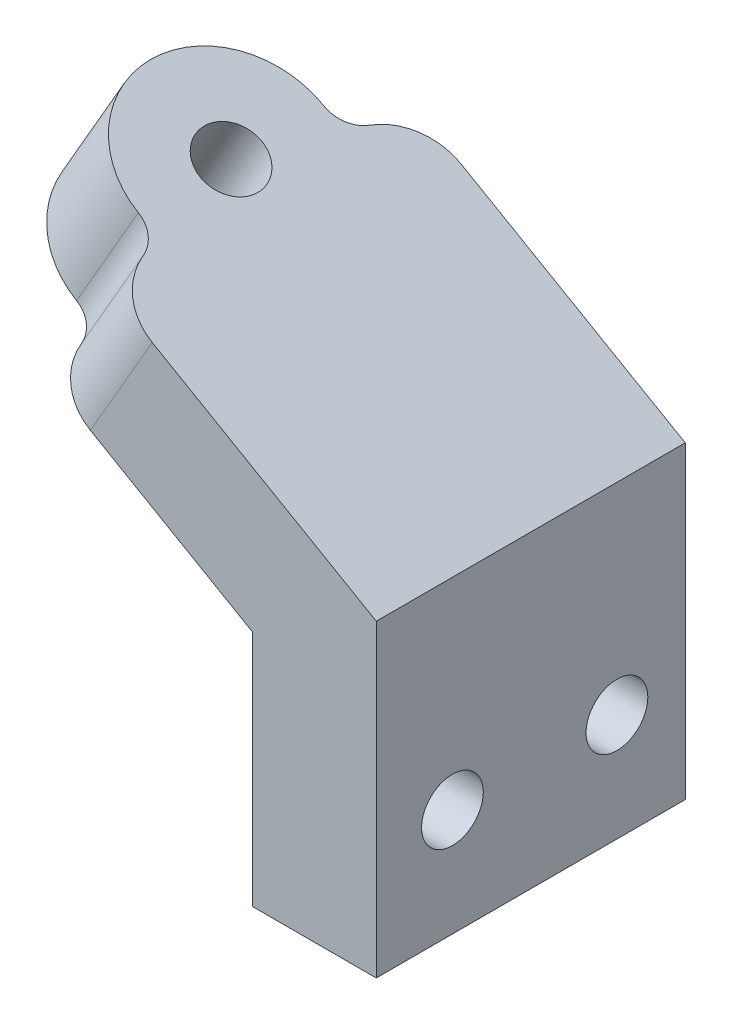
ISO-10303-21;
HEADER;
FILE_DESCRIPTION(('STEP AP214'),'2;1');
FILE_NAME('part.step','',(''),(''),'','','');
FILE_SCHEMA(('AUTOMOTIVE_DESIGN { 1 0 10303 214 1 1 1 1 }'));
ENDSEC;
DATA;
#1=APPLICATION_CONTEXT('core data for automotive mechanical design processes');
#2=APPLICATION_PROTOCOL_DEFINITION('international standard','automotive_design',2000,#1);
#3=PRODUCT_CONTEXT('',#1,'mechanical');
#4=PRODUCT('Part','Part','',(#3));
#5=PRODUCT_RELATED_PRODUCT_CATEGORY('part','',(#4));
#6=PRODUCT_DEFINITION_FORMATION('','',#4);
#7=PRODUCT_DEFINITION_CONTEXT('part definition',#1,'design');
#8=PRODUCT_DEFINITION('design','',#6,#7);
#9=PRODUCT_DEFINITION_SHAPE('','',#8);
#10=(LENGTH_UNIT() NAMED_UNIT(*) SI_UNIT(.MILLI.,.METRE.));
#11=(NAMED_UNIT(*) PLANE_ANGLE_UNIT() SI_UNIT($,.RADIAN.));
#12=(NAMED_UNIT(*) SI_UNIT($,.STERADIAN.) SOLID_ANGLE_UNIT());
#13=UNCERTAINTY_MEASURE_WITH_UNIT(LENGTH_MEASURE(1.E-05),#10,'distance_accuracy_value','');
#14=(GEOMETRIC_REPRESENTATION_CONTEXT(3) GLOBAL_UNCERTAINTY_ASSIGNED_CONTEXT((#13)) GLOBAL_UNIT_ASSIGNED_CONTEXT((#10,
#11,#12)) REPRESENTATION_CONTEXT('',''));
#15=CARTESIAN_POINT('',(0.,0.,0.));
#16=DIRECTION('',(0.,0.,1.));
#17=DIRECTION('',(1.,0.,0.));
#18=AXIS2_PLACEMENT_3D('',#15,#16,#17);
#19=CARTESIAN_POINT('',(10.,0.,50.));
#20=DIRECTION('',(-1.,0.,0.));
#21=DIRECTION('',(0.,-1.,0.));
#22=AXIS2_PLACEMENT_3D('',#19,#20,#21);
#23=PLANE('',#22);
#24=CARTESIAN_POINT('',(10.,17.3995743342104,37.6752128328949));
#25=DIRECTION('',(1.,0.,0.));
#26=DIRECTION('',(0.,0.,-1.));
#27=AXIS2_PLACEMENT_3D('',#24,#25,#26);
#28=CIRCLE('',#27,5.00000000000001);
#29=CARTESIAN_POINT('',(10.,17.3995743342104,32.6752128328949));
#30=VERTEX_POINT('',#29);
#31=EDGE_CURVE('E253',#30,#30,#28,.T.);
#32=ORIENTED_EDGE('',*,*,#31,.F.);
#33=EDGE_LOOP('',(#32));
#34=FACE_BOUND('',#33,.T.);
#35=DIRECTION('',(0.,1.,0.));
#36=VECTOR('',#35,1.);
#37=CARTESIAN_POINT('',(10.,0.,0.));
#38=LINE('',#37,#36);
#39=CARTESIAN_POINT('',(10.,0.,0.));
#40=VERTEX_POINT('',#39);
#41=CARTESIAN_POINT('',(9.99999999999999,50.,0.));
#42=VERTEX_POINT('',#41);
#43=EDGE_CURVE('E188',#40,#42,#38,.T.);
#44=ORIENTED_EDGE('',*,*,#43,.T.);
#45=DIRECTION('',(0.,0.,-1.));
#46=VECTOR('',#45,1.);
#47=CARTESIAN_POINT('',(9.99999999999999,50.,50.));
#48=LINE('',#47,#46);
#49=CARTESIAN_POINT('',(9.99999999999999,50.,50.));
#50=VERTEX_POINT('',#49);
#51=EDGE_CURVE('E199',#50,#42,#48,.T.);
#52=ORIENTED_EDGE('',*,*,#51,.F.);
#53=DIRECTION('',(0.,1.,0.));
#54=VECTOR('',#53,1.);
#55=CARTESIAN_POINT('',(10.,0.,50.));
#56=LINE('',#55,#54);
#57=CARTESIAN_POINT('',(10.,0.,50.));
#58=VERTEX_POINT('',#57);
#59=EDGE_CURVE('E172',#58,#50,#56,.T.);
#60=ORIENTED_EDGE('',*,*,#59,.F.);
#61=DIRECTION('',(0.,0.,-1.));
#62=VECTOR('',#61,1.);
#63=CARTESIAN_POINT('',(10.,0.,50.));
#64=LINE('',#63,#62);
#65=EDGE_CURVE('E203',#58,#40,#64,.T.);
#66=ORIENTED_EDGE('',*,*,#65,.T.);
#67=EDGE_LOOP('',(#44,#52,#60,#66));
#68=FACE_BOUND('',#67,.T.);
#69=CARTESIAN_POINT('',(10.,17.3995743342104,11.0572658838156));
#70=DIRECTION('',(1.,0.,0.));
#71=DIRECTION('',(0.,0.,-1.));
#72=AXIS2_PLACEMENT_3D('',#69,#70,#71);
#73=CIRCLE('',#72,5.00000000000001);
#74=CARTESIAN_POINT('',(10.,17.3995743342104,6.0572658838156));
#75=VERTEX_POINT('',#74);
#76=EDGE_CURVE('E247',#75,#75,#73,.T.);
#77=ORIENTED_EDGE('',*,*,#76,.F.);
#78=EDGE_LOOP('',(#77));
#79=FACE_BOUND('',#78,.T.);
#80=ADVANCED_FACE('F45',(#34,#68,#79),#23,.F.);
#81=CARTESIAN_POINT('',(-10.,38.4529946162074,50.));
#82=DIRECTION('',(1.,0.,0.));
#83=DIRECTION('',(0.,1.,0.));
#84=AXIS2_PLACEMENT_3D('',#81,#82,#83);
#85=PLANE('',#84);
#86=CARTESIAN_POINT('',(-10.,17.3995743342104,37.6752128328949));
#87=DIRECTION('',(1.,0.,0.));
#88=DIRECTION('',(0.,1.,0.));
#89=AXIS2_PLACEMENT_3D('',#86,#87,#88);
#90=CIRCLE('',#89,5.00000000000001);
#91=CARTESIAN_POINT('',(-10.,22.3995743342104,37.6752128328949));
#92=VERTEX_POINT('',#91);
#93=EDGE_CURVE('E49',#92,#92,#90,.T.);
#94=ORIENTED_EDGE('',*,*,#93,.T.);
#95=EDGE_LOOP('',(#94));
#96=FACE_BOUND('',#95,.T.);
#97=CARTESIAN_POINT('',(-10.,17.3995743342104,11.0572658838156));
#98=DIRECTION('',(1.,0.,0.));
#99=DIRECTION('',(0.,1.,0.));
#100=AXIS2_PLACEMENT_3D('',#97,#98,#99);
#101=CIRCLE('',#100,5.00000000000001);
#102=CARTESIAN_POINT('',(-10.,22.3995743342104,11.0572658838156));
#103=VERTEX_POINT('',#102);
#104=EDGE_CURVE('E241',#103,#103,#101,.T.);
#105=ORIENTED_EDGE('',*,*,#104,.T.);
#106=EDGE_LOOP('',(#105));
#107=FACE_BOUND('',#106,.T.);
#108=DIRECTION('',(0.,-1.,0.));
#109=VECTOR('',#108,1.);
#110=CARTESIAN_POINT('',(-10.,38.4529946162074,0.));
#111=LINE('',#110,#109);
#112=CARTESIAN_POINT('',(-10.,38.4529946162074,0.));
#113=VERTEX_POINT('',#112);
#114=CARTESIAN_POINT('',(-10.,0.,0.));
#115=VERTEX_POINT('',#114);
#116=EDGE_CURVE('E163',#113,#115,#111,.T.);
#117=ORIENTED_EDGE('',*,*,#116,.T.);
#118=DIRECTION('',(0.,0.,-1.));
#119=VECTOR('',#118,1.);
#120=CARTESIAN_POINT('',(-10.,0.,50.));
#121=LINE('',#120,#119);
#122=CARTESIAN_POINT('',(-10.,0.,50.));
#123=VERTEX_POINT('',#122);
#124=EDGE_CURVE('E207',#123,#115,#121,.T.);
#125=ORIENTED_EDGE('',*,*,#124,.F.);
#126=DIRECTION('',(0.,-1.,0.));
#127=VECTOR('',#126,1.);
#128=CARTESIAN_POINT('',(-10.,38.4529946162074,50.));
#129=LINE('',#128,#127);
#130=CARTESIAN_POINT('',(-10.,38.4529946162074,50.));
#131=VERTEX_POINT('',#130);
#132=EDGE_CURVE('E164',#131,#123,#129,.T.);
#133=ORIENTED_EDGE('',*,*,#132,.F.);
#134=DIRECTION('',(0.,0.,-1.));
#135=VECTOR('',#134,1.);
#136=CARTESIAN_POINT('',(-10.,38.4529946162074,50.));
#137=LINE('',#136,#135);
#138=EDGE_CURVE('E181',#131,#113,#137,.T.);
#139=ORIENTED_EDGE('',*,*,#138,.T.);
#140=EDGE_LOOP('',(#117,#125,#133,#139));
#141=FACE_BOUND('',#140,.T.);
#142=ADVANCED_FACE('F262',(#96,#107,#141),#85,.F.);
#143=CARTESIAN_POINT('',(-10.,0.,50.));
#144=DIRECTION('',(0.,1.,0.));
#145=DIRECTION('',(-1.,0.,0.));
#146=AXIS2_PLACEMENT_3D('',#143,#144,#145);
#147=PLANE('',#146);
#148=DIRECTION('',(1.,0.,0.));
#149=VECTOR('',#148,1.);
#150=CARTESIAN_POINT('',(-10.,0.,0.));
#151=LINE('',#150,#149);
#152=EDGE_CURVE('E185',#115,#40,#151,.T.);
#153=ORIENTED_EDGE('',*,*,#152,.T.);
#154=ORIENTED_EDGE('',*,*,#65,.F.);
#155=DIRECTION('',(1.,0.,0.));
#156=VECTOR('',#155,1.);
#157=CARTESIAN_POINT('',(-10.,0.,50.));
#158=LINE('',#157,#156);
#159=EDGE_CURVE('E168',#123,#58,#158,.T.);
#160=ORIENTED_EDGE('',*,*,#159,.F.);
#161=ORIENTED_EDGE('',*,*,#124,.T.);
#162=EDGE_LOOP('',(#153,#154,#160,#161));
#163=FACE_BOUND('',#162,.T.);
#164=ADVANCED_FACE('F282',(#163),#147,.F.);
#165=CARTESIAN_POINT('',(9.99999999999999,50.,50.));
#166=DIRECTION('',(-0.499999999999997,-0.86602540378444,0.));
#167=DIRECTION('',(0.86602540378444,-0.499999999999998,0.));
#168=AXIS2_PLACEMENT_3D('',#165,#166,#167);
#169=PLANE('',#168);
#170=CARTESIAN_POINT('',(-38.4974226119287,78.,25.));
#171=DIRECTION('',(0.499999999999998,0.86602540378444,0.));
#172=DIRECTION('',(-0.86602540378444,0.499999999999998,0.));
#173=AXIS2_PLACEMENT_3D('',#170,#171,#172);
#174=CIRCLE('',#173,5.00000000000002);
#175=CARTESIAN_POINT('',(-42.8275496308509,80.5,25.));
#176=VERTEX_POINT('',#175);
#177=EDGE_CURVE('E235',#176,#176,#174,.T.);
#178=ORIENTED_EDGE('',*,*,#177,.F.);
#179=EDGE_LOOP('',(#178));
#180=FACE_BOUND('',#179,.T.);
#181=DIRECTION('',(-0.86602540378444,0.499999999999997,0.));
#182=VECTOR('',#181,1.);
#183=CARTESIAN_POINT('',(9.99999999999999,50.,0.));
#184=LINE('',#183,#182);
#185=CARTESIAN_POINT('',(-26.2499738980128,70.9289321881345,0.));
#186=VERTEX_POINT('',#185);
#187=EDGE_CURVE('E191',#42,#186,#184,.T.);
#188=ORIENTED_EDGE('',*,*,#187,.T.);
#189=CARTESIAN_POINT('',(-26.2499738980128,70.9289321881345,10.));
#190=DIRECTION('',(-0.499999999999997,-0.86602540378444,0.));
#191=DIRECTION('',(0.86602540378444,-0.499999999999998,0.));
#192=AXIS2_PLACEMENT_3D('',#189,#190,#191);
#193=CIRCLE('',#192,10.);
#194=CARTESIAN_POINT('',(-34.4149397072901,75.6429773960448,6.66666666666667));
#195=VERTEX_POINT('',#194);
#196=EDGE_CURVE('E220',#186,#195,#193,.F.);
#197=ORIENTED_EDGE('',*,*,#196,.T.);
#198=CARTESIAN_POINT('',(-38.4974226119287,78.,5.00000000000001));
#199=DIRECTION('',(0.499999999999998,0.86602540378444,0.));
#200=DIRECTION('',(-0.86602540378444,0.499999999999998,0.));
#201=AXIS2_PLACEMENT_3D('',#198,#199,#200);
#202=CIRCLE('',#201,5.);
#203=CARTESIAN_POINT('',(-38.4974226119287,78.,10.));
#204=VERTEX_POINT('',#203);
#205=EDGE_CURVE('E134',#204,#195,#202,.T.);
#206=ORIENTED_EDGE('',*,*,#205,.F.);
#207=CARTESIAN_POINT('',(-38.4974226119287,78.,25.));
#208=DIRECTION('',(-0.499999999999998,-0.86602540378444,0.));
#209=DIRECTION('',(-0.86602540378444,0.499999999999998,0.));
#210=AXIS2_PLACEMENT_3D('',#207,#208,#209);
#211=CIRCLE('',#210,15.);
#212=CARTESIAN_POINT('',(-38.4974226119287,78.,40.));
#213=VERTEX_POINT('',#212);
#214=EDGE_CURVE('E133',#213,#204,#211,.T.);
#215=ORIENTED_EDGE('',*,*,#214,.F.);
#216=CARTESIAN_POINT('',(-38.4974226119287,78.,45.));
#217=DIRECTION('',(0.499999999999998,0.86602540378444,0.));
#218=DIRECTION('',(0.86602540378444,-0.499999999999998,0.));
#219=AXIS2_PLACEMENT_3D('',#216,#217,#218);
#220=CIRCLE('',#219,4.99999999999999);
#221=CARTESIAN_POINT('',(-34.4149397072901,75.6429773960448,43.3333333333333));
#222=VERTEX_POINT('',#221);
#223=EDGE_CURVE('E125',#222,#213,#220,.T.);
#224=ORIENTED_EDGE('',*,*,#223,.F.);
#225=CARTESIAN_POINT('',(-26.2499738980128,70.9289321881345,40.));
#226=DIRECTION('',(-0.499999999999997,-0.86602540378444,0.));
#227=DIRECTION('',(0.86602540378444,-0.499999999999998,0.));
#228=AXIS2_PLACEMENT_3D('',#225,#226,#227);
#229=CIRCLE('',#228,10.);
#230=CARTESIAN_POINT('',(-26.2499738980128,70.9289321881345,50.));
#231=VERTEX_POINT('',#230);
#232=EDGE_CURVE('E217',#222,#231,#229,.F.);
#233=ORIENTED_EDGE('',*,*,#232,.T.);
#234=DIRECTION('',(-0.86602540378444,0.499999999999997,0.));
#235=VECTOR('',#234,1.);
#236=CARTESIAN_POINT('',(9.99999999999999,50.,50.));
#237=LINE('',#236,#235);
#238=EDGE_CURVE('E175',#50,#231,#237,.T.);
#239=ORIENTED_EDGE('',*,*,#238,.F.);
#240=ORIENTED_EDGE('',*,*,#51,.T.);
#241=EDGE_LOOP('',(#188,#197,#206,#215,#224,#233,#239,#240));
#242=FACE_BOUND('',#241,.T.);
#243=ADVANCED_FACE('F148',(#180,#242),#169,.F.);
#244=CARTESIAN_POINT('',(-62.3538290724797,68.679491924311,50.));
#245=DIRECTION('',(0.499999999999998,0.86602540378444,0.));
#246=DIRECTION('',(-0.86602540378444,0.499999999999998,0.));
#247=AXIS2_PLACEMENT_3D('',#244,#245,#246);
#248=PLANE('',#247);
#249=CARTESIAN_POINT('',(-48.4974226119287,60.6794919243111,25.));
#250=DIRECTION('',(0.499999999999998,0.86602540378444,0.));
#251=DIRECTION('',(-0.86602540378444,0.499999999999998,0.));
#252=AXIS2_PLACEMENT_3D('',#249,#250,#251);
#253=CIRCLE('',#252,5.00000000000001);
#254=CARTESIAN_POINT('',(-52.8275496308509,63.1794919243111,25.));
#255=VERTEX_POINT('',#254);
#256=EDGE_CURVE('E232',#255,#255,#253,.T.);
#257=ORIENTED_EDGE('',*,*,#256,.T.);
#258=EDGE_LOOP('',(#257));
#259=FACE_BOUND('',#258,.T.);
#260=CARTESIAN_POINT('',(-48.4974226119287,60.6794919243111,5.00000000000001));
#261=DIRECTION('',(0.499999999999998,0.86602540378444,0.));
#262=DIRECTION('',(-0.86602540378444,0.499999999999998,0.));
#263=AXIS2_PLACEMENT_3D('',#260,#261,#262);
#264=CIRCLE('',#263,5.);
#265=CARTESIAN_POINT('',(-48.4974226119287,60.6794919243111,10.));
#266=VERTEX_POINT('',#265);
#267=CARTESIAN_POINT('',(-44.4149397072901,58.322469320356,6.66666666666667));
#268=VERTEX_POINT('',#267);
#269=EDGE_CURVE('E155',#266,#268,#264,.T.);
#270=ORIENTED_EDGE('',*,*,#269,.T.);
#271=CARTESIAN_POINT('',(-36.2499738980128,53.6084241124457,10.));
#272=DIRECTION('',(0.499999999999998,0.86602540378444,0.));
#273=DIRECTION('',(-0.86602540378444,0.499999999999998,0.));
#274=AXIS2_PLACEMENT_3D('',#271,#272,#273);
#275=CIRCLE('',#274,10.);
#276=CARTESIAN_POINT('',(-36.2499738980128,53.6084241124457,0.));
#277=VERTEX_POINT('',#276);
#278=EDGE_CURVE('E228',#268,#277,#275,.F.);
#279=ORIENTED_EDGE('',*,*,#278,.T.);
#280=DIRECTION('',(0.86602540378444,-0.499999999999998,0.));
#281=VECTOR('',#280,1.);
#282=CARTESIAN_POINT('',(-62.3538290724797,68.679491924311,0.));
#283=LINE('',#282,#281);
#284=EDGE_CURVE('E169',#277,#113,#283,.T.);
#285=ORIENTED_EDGE('',*,*,#284,.T.);
#286=ORIENTED_EDGE('',*,*,#138,.F.);
#287=DIRECTION('',(0.86602540378444,-0.499999999999998,0.));
#288=VECTOR('',#287,1.);
#289=CARTESIAN_POINT('',(-62.3538290724797,68.679491924311,50.));
#290=LINE('',#289,#288);
#291=CARTESIAN_POINT('',(-36.2499738980128,53.6084241124457,50.));
#292=VERTEX_POINT('',#291);
#293=EDGE_CURVE('E178',#292,#131,#290,.T.);
#294=ORIENTED_EDGE('',*,*,#293,.F.);
#295=CARTESIAN_POINT('',(-36.2499738980128,53.6084241124457,40.));
#296=DIRECTION('',(0.499999999999998,0.86602540378444,0.));
#297=DIRECTION('',(-0.86602540378444,0.499999999999998,0.));
#298=AXIS2_PLACEMENT_3D('',#295,#296,#297);
#299=CIRCLE('',#298,10.);
#300=CARTESIAN_POINT('',(-44.4149397072901,58.322469320356,43.3333333333333));
#301=VERTEX_POINT('',#300);
#302=EDGE_CURVE('E63',#292,#301,#299,.F.);
#303=ORIENTED_EDGE('',*,*,#302,.T.);
#304=CARTESIAN_POINT('',(-48.4974226119287,60.6794919243111,45.));
#305=DIRECTION('',(0.499999999999998,0.86602540378444,0.));
#306=DIRECTION('',(-0.86602540378444,0.499999999999998,0.));
#307=AXIS2_PLACEMENT_3D('',#304,#305,#306);
#308=CIRCLE('',#307,4.99999999999999);
#309=CARTESIAN_POINT('',(-48.4974226119287,60.6794919243111,40.));
#310=VERTEX_POINT('',#309);
#311=EDGE_CURVE('E160',#301,#310,#308,.T.);
#312=ORIENTED_EDGE('',*,*,#311,.T.);
#313=CARTESIAN_POINT('',(-48.4974226119287,60.6794919243111,25.));
#314=DIRECTION('',(0.499999999999998,0.86602540378444,0.));
#315=DIRECTION('',(-0.86602540378444,0.499999999999998,0.));
#316=AXIS2_PLACEMENT_3D('',#313,#314,#315);
#317=CIRCLE('',#316,15.);
#318=EDGE_CURVE('E143',#310,#266,#317,.F.);
#319=ORIENTED_EDGE('',*,*,#318,.T.);
#320=EDGE_LOOP('',(#270,#279,#285,#286,#294,#303,#312,#319));
#321=FACE_BOUND('',#320,.T.);
#322=ADVANCED_FACE('F305',(#259,#321),#248,.F.);
#323=CARTESIAN_POINT('',(0.,0.,50.));
#324=DIRECTION('',(0.,0.,1.));
#325=DIRECTION('',(1.,0.,0.));
#326=AXIS2_PLACEMENT_3D('',#323,#324,#325);
#327=PLANE('',#326);
#328=ORIENTED_EDGE('',*,*,#238,.T.);
#329=DIRECTION('',(-0.499999999999998,-0.86602540378444,0.));
#330=VECTOR('',#329,1.);
#331=CARTESIAN_POINT('',(-36.2499738980128,53.6084241124457,50.));
#332=LINE('',#331,#330);
#333=EDGE_CURVE('E11',#231,#292,#332,.T.);
#334=ORIENTED_EDGE('',*,*,#333,.T.);
#335=ORIENTED_EDGE('',*,*,#293,.T.);
#336=ORIENTED_EDGE('',*,*,#132,.T.);
#337=ORIENTED_EDGE('',*,*,#159,.T.);
#338=ORIENTED_EDGE('',*,*,#59,.T.);
#339=EDGE_LOOP('',(#328,#334,#335,#336,#337,#338));
#340=FACE_BOUND('',#339,.T.);
#341=ADVANCED_FACE('F316',(#340),#327,.T.);
#342=CARTESIAN_POINT('',(0.,0.,0.));
#343=DIRECTION('',(0.,0.,1.));
#344=DIRECTION('',(1.,0.,0.));
#345=AXIS2_PLACEMENT_3D('',#342,#343,#344);
#346=PLANE('',#345);
#347=ORIENTED_EDGE('',*,*,#284,.F.);
#348=DIRECTION('',(0.499999999999998,0.86602540378444,0.));
#349=VECTOR('',#348,1.);
#350=CARTESIAN_POINT('',(-50.4006089926237,29.0988051692122,0.));
#351=LINE('',#350,#349);
#352=EDGE_CURVE('E213',#277,#186,#351,.T.);
#353=ORIENTED_EDGE('',*,*,#352,.T.);
#354=ORIENTED_EDGE('',*,*,#187,.F.);
#355=ORIENTED_EDGE('',*,*,#43,.F.);
#356=ORIENTED_EDGE('',*,*,#152,.F.);
#357=ORIENTED_EDGE('',*,*,#116,.F.);
#358=EDGE_LOOP('',(#347,#353,#354,#355,#356,#357));
#359=FACE_BOUND('',#358,.T.);
#360=ADVANCED_FACE('F309',(#359),#346,.F.);
#361=CARTESIAN_POINT('',(-78.2365149746594,9.16987298107767,25.));
#362=DIRECTION('',(0.499999999999998,0.86602540378444,0.));
#363=DIRECTION('',(-0.86602540378444,0.499999999999998,0.));
#364=AXIS2_PLACEMENT_3D('',#361,#362,#363);
#365=CYLINDRICAL_SURFACE('',#364,15.);
#366=DIRECTION('',(0.499999999999998,0.86602540378444,0.));
#367=VECTOR('',#366,1.);
#368=CARTESIAN_POINT('',(-78.2365149746594,9.16987298107767,40.));
#369=LINE('',#368,#367);
#370=EDGE_CURVE('E128',#310,#213,#369,.T.);
#371=ORIENTED_EDGE('',*,*,#370,.T.);
#372=ORIENTED_EDGE('',*,*,#214,.T.);
#373=DIRECTION('',(0.499999999999998,0.86602540378444,0.));
#374=VECTOR('',#373,1.);
#375=CARTESIAN_POINT('',(-78.2365149746594,9.16987298107767,10.));
#376=LINE('',#375,#374);
#377=EDGE_CURVE('E145',#266,#204,#376,.T.);
#378=ORIENTED_EDGE('',*,*,#377,.F.);
#379=ORIENTED_EDGE('',*,*,#318,.F.);
#380=EDGE_LOOP('',(#371,#372,#378,#379));
#381=FACE_BOUND('',#380,.T.);
#382=ADVANCED_FACE('F139',(#381),#365,.T.);
#383=CARTESIAN_POINT('',(-78.2365149746594,9.16987298107767,45.));
#384=DIRECTION('',(0.499999999999998,0.86602540378444,0.));
#385=DIRECTION('',(-0.86602540378444,0.499999999999998,0.));
#386=AXIS2_PLACEMENT_3D('',#383,#384,#385);
#387=CYLINDRICAL_SURFACE('',#386,4.99999999999999);
#388=ORIENTED_EDGE('',*,*,#311,.F.);
#389=DIRECTION('',(0.499999999999998,0.86602540378444,0.));
#390=VECTOR('',#389,1.);
#391=CARTESIAN_POINT('',(-74.1540320700208,6.81285037712253,43.3333333333333));
#392=LINE('',#391,#390);
#393=EDGE_CURVE('E55',#301,#222,#392,.T.);
#394=ORIENTED_EDGE('',*,*,#393,.T.);
#395=ORIENTED_EDGE('',*,*,#223,.T.);
#396=ORIENTED_EDGE('',*,*,#370,.F.);
#397=EDGE_LOOP('',(#388,#394,#395,#396));
#398=FACE_BOUND('',#397,.T.);
#399=ADVANCED_FACE('F127',(#398),#387,.F.);
#400=CARTESIAN_POINT('',(-78.2365149746594,9.16987298107767,5.00000000000001));
#401=DIRECTION('',(0.499999999999998,0.86602540378444,0.));
#402=DIRECTION('',(-0.86602540378444,0.499999999999998,0.));
#403=AXIS2_PLACEMENT_3D('',#400,#401,#402);
#404=CYLINDRICAL_SURFACE('',#403,5.);
#405=ORIENTED_EDGE('',*,*,#205,.T.);
#406=DIRECTION('',(0.499999999999998,0.86602540378444,0.));
#407=VECTOR('',#406,1.);
#408=CARTESIAN_POINT('',(-74.1540320700207,6.81285037712252,6.66666666666667));
#409=LINE('',#408,#407);
#410=EDGE_CURVE('E223',#195,#268,#409,.F.);
#411=ORIENTED_EDGE('',*,*,#410,.T.);
#412=ORIENTED_EDGE('',*,*,#269,.F.);
#413=ORIENTED_EDGE('',*,*,#377,.T.);
#414=EDGE_LOOP('',(#405,#411,#412,#413));
#415=FACE_BOUND('',#414,.T.);
#416=ADVANCED_FACE('F292',(#415),#404,.F.);
#417=CARTESIAN_POINT('',(-65.9890662607435,2.09880516921223,10.));
#418=DIRECTION('',(0.499999999999998,0.86602540378444,0.));
#419=DIRECTION('',(-0.86602540378444,0.499999999999998,0.));
#420=AXIS2_PLACEMENT_3D('',#417,#418,#419);
#421=CYLINDRICAL_SURFACE('',#420,10.);
#422=ORIENTED_EDGE('',*,*,#278,.F.);
#423=ORIENTED_EDGE('',*,*,#410,.F.);
#424=ORIENTED_EDGE('',*,*,#196,.F.);
#425=ORIENTED_EDGE('',*,*,#352,.F.);
#426=EDGE_LOOP('',(#422,#423,#424,#425));
#427=FACE_BOUND('',#426,.T.);
#428=ADVANCED_FACE('F290',(#427),#421,.T.);
#429=CARTESIAN_POINT('',(-65.9890662607435,2.09880516921224,40.));
#430=DIRECTION('',(0.499999999999998,0.86602540378444,0.));
#431=DIRECTION('',(-0.86602540378444,0.499999999999998,0.));
#432=AXIS2_PLACEMENT_3D('',#429,#430,#431);
#433=CYLINDRICAL_SURFACE('',#432,10.);
#434=ORIENTED_EDGE('',*,*,#302,.F.);
#435=ORIENTED_EDGE('',*,*,#333,.F.);
#436=ORIENTED_EDGE('',*,*,#232,.F.);
#437=ORIENTED_EDGE('',*,*,#393,.F.);
#438=EDGE_LOOP('',(#434,#435,#436,#437));
#439=FACE_BOUND('',#438,.T.);
#440=ADVANCED_FACE('F47',(#439),#433,.T.);
#441=CARTESIAN_POINT('',(-38.4974226119287,78.,25.));
#442=DIRECTION('',(0.499999999999998,0.86602540378444,0.));
#443=DIRECTION('',(-0.86602540378444,0.499999999999998,0.));
#444=AXIS2_PLACEMENT_3D('',#441,#442,#443);
#445=CYLINDRICAL_SURFACE('',#444,5.00000000000001);
#446=ORIENTED_EDGE('',*,*,#177,.T.);
#447=EDGE_LOOP('',(#446));
#448=FACE_BOUND('',#447,.T.);
#449=ORIENTED_EDGE('',*,*,#256,.F.);
#450=EDGE_LOOP('',(#449));
#451=FACE_BOUND('',#450,.T.);
#452=ADVANCED_FACE('F272',(#448,#451),#445,.F.);
#453=CARTESIAN_POINT('',(10.,17.3995743342104,11.0572658838156));
#454=DIRECTION('',(1.,0.,0.));
#455=DIRECTION('',(0.,0.,-1.));
#456=AXIS2_PLACEMENT_3D('',#453,#454,#455);
#457=CYLINDRICAL_SURFACE('',#456,5.00000000000001);
#458=ORIENTED_EDGE('',*,*,#76,.T.);
#459=EDGE_LOOP('',(#458));
#460=FACE_BOUND('',#459,.T.);
#461=ORIENTED_EDGE('',*,*,#104,.F.);
#462=EDGE_LOOP('',(#461));
#463=FACE_BOUND('',#462,.T.);
#464=ADVANCED_FACE('F267',(#460,#463),#457,.F.);
#465=CARTESIAN_POINT('',(10.,17.3995743342104,37.6752128328949));
#466=DIRECTION('',(1.,0.,0.));
#467=DIRECTION('',(0.,0.,-1.));
#468=AXIS2_PLACEMENT_3D('',#465,#466,#467);
#469=CYLINDRICAL_SURFACE('',#468,5.00000000000001);
#470=ORIENTED_EDGE('',*,*,#31,.T.);
#471=EDGE_LOOP('',(#470));
#472=FACE_BOUND('',#471,.T.);
#473=ORIENTED_EDGE('',*,*,#93,.F.);
#474=EDGE_LOOP('',(#473));
#475=FACE_BOUND('',#474,.T.);
#476=ADVANCED_FACE('F265',(#472,#475),#469,.F.);
#477=CLOSED_SHELL('',(#80,#142,#164,#243,#322,#341,#360,#382,#399,#416,#428,#440,#452,#464,#476));
#478=MANIFOLD_SOLID_BREP('B2',#477);
#479=ADVANCED_BREP_SHAPE_REPRESENTATION('',(#18,#478),#14);
#480=SHAPE_DEFINITION_REPRESENTATION(#9,#479);
ENDSEC;
END-ISO-10303-21;
